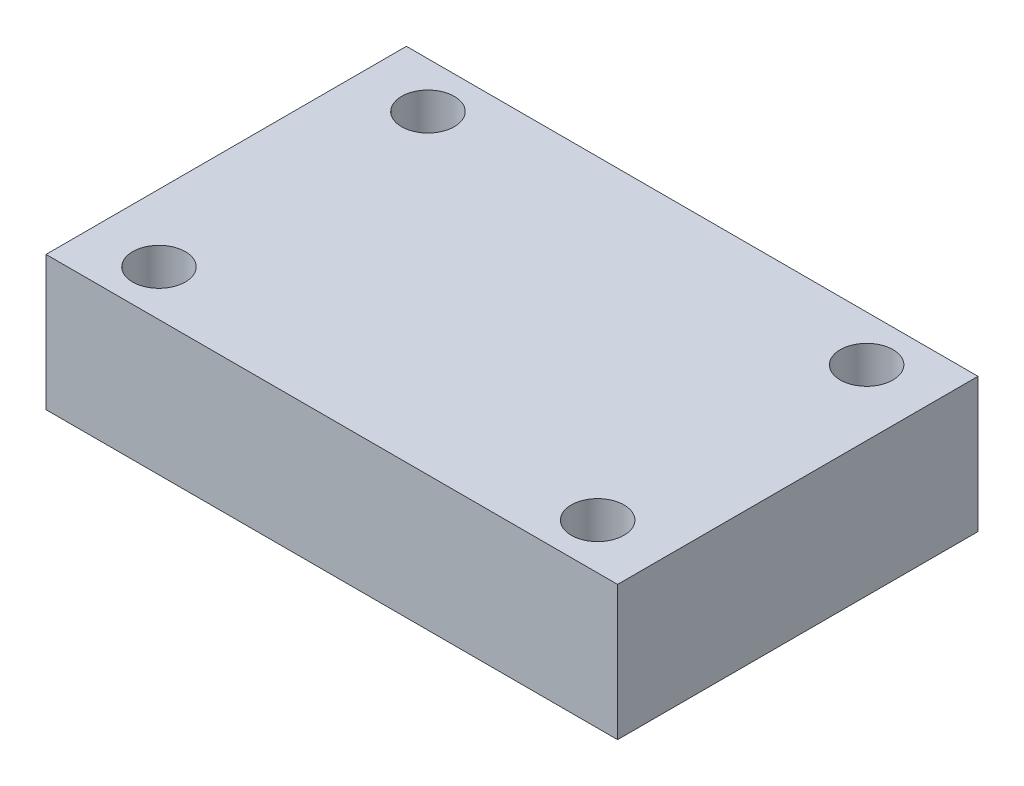
ISO-10303-21;
HEADER;
FILE_DESCRIPTION(('STEP AP214'),'2;1');
FILE_NAME('part.step','',(''),(''),'','','');
FILE_SCHEMA(('AUTOMOTIVE_DESIGN { 1 0 10303 214 1 1 1 1 }'));
ENDSEC;
DATA;
#1=APPLICATION_CONTEXT('core data for automotive mechanical design processes');
#2=APPLICATION_PROTOCOL_DEFINITION('international standard','automotive_design',2000,#1);
#3=PRODUCT_CONTEXT('',#1,'mechanical');
#4=PRODUCT('Part','Part','',(#3));
#5=PRODUCT_RELATED_PRODUCT_CATEGORY('part','',(#4));
#6=PRODUCT_DEFINITION_FORMATION('','',#4);
#7=PRODUCT_DEFINITION_CONTEXT('part definition',#1,'design');
#8=PRODUCT_DEFINITION('design','',#6,#7);
#9=PRODUCT_DEFINITION_SHAPE('','',#8);
#10=(LENGTH_UNIT() NAMED_UNIT(*) SI_UNIT(.MILLI.,.METRE.));
#11=(NAMED_UNIT(*) PLANE_ANGLE_UNIT() SI_UNIT($,.RADIAN.));
#12=(NAMED_UNIT(*) SI_UNIT($,.STERADIAN.) SOLID_ANGLE_UNIT());
#13=UNCERTAINTY_MEASURE_WITH_UNIT(LENGTH_MEASURE(1.E-05),#10,'distance_accuracy_value','');
#14=(GEOMETRIC_REPRESENTATION_CONTEXT(3) GLOBAL_UNCERTAINTY_ASSIGNED_CONTEXT((#13)) GLOBAL_UNIT_ASSIGNED_CONTEXT((#10,
#11,#12)) REPRESENTATION_CONTEXT('',''));
#15=CARTESIAN_POINT('',(0.,0.,0.));
#16=DIRECTION('',(0.,0.,1.));
#17=DIRECTION('',(1.,0.,0.));
#18=AXIS2_PLACEMENT_3D('',#15,#16,#17);
#19=CARTESIAN_POINT('',(26.9875,12.7,-17.018));
#20=DIRECTION('',(-1.,0.,0.));
#21=DIRECTION('',(0.,0.,1.));
#22=AXIS2_PLACEMENT_3D('',#19,#20,#21);
#23=PLANE('',#22);
#24=DIRECTION('',(0.,0.,-1.));
#25=VECTOR('',#24,1.);
#26=CARTESIAN_POINT('',(26.9875,0.,-17.018));
#27=LINE('',#26,#25);
#28=CARTESIAN_POINT('',(26.9875,0.,17.018));
#29=VERTEX_POINT('',#28);
#30=CARTESIAN_POINT('',(26.9875,0.,-17.018));
#31=VERTEX_POINT('',#30);
#32=EDGE_CURVE('E100',#29,#31,#27,.T.);
#33=ORIENTED_EDGE('',*,*,#32,.T.);
#34=DIRECTION('',(0.,-1.,0.));
#35=VECTOR('',#34,1.);
#36=CARTESIAN_POINT('',(26.9875,12.7,-17.018));
#37=LINE('',#36,#35);
#38=CARTESIAN_POINT('',(26.9875,12.7,-17.018));
#39=VERTEX_POINT('',#38);
#40=EDGE_CURVE('E11',#39,#31,#37,.T.);
#41=ORIENTED_EDGE('',*,*,#40,.F.);
#42=DIRECTION('',(0.,0.,-1.));
#43=VECTOR('',#42,1.);
#44=CARTESIAN_POINT('',(26.9875,12.7,-17.018));
#45=LINE('',#44,#43);
#46=CARTESIAN_POINT('',(26.9875,12.7,17.018));
#47=VERTEX_POINT('',#46);
#48=EDGE_CURVE('E88',#47,#39,#45,.T.);
#49=ORIENTED_EDGE('',*,*,#48,.F.);
#50=DIRECTION('',(0.,-1.,0.));
#51=VECTOR('',#50,1.);
#52=CARTESIAN_POINT('',(26.9875,12.7,17.018));
#53=LINE('',#52,#51);
#54=EDGE_CURVE('E96',#47,#29,#53,.T.);
#55=ORIENTED_EDGE('',*,*,#54,.T.);
#56=EDGE_LOOP('',(#33,#41,#49,#55));
#57=FACE_BOUND('',#56,.T.);
#58=ADVANCED_FACE('F37',(#57),#23,.F.);
#59=CARTESIAN_POINT('',(-26.9875,12.7,-17.018));
#60=DIRECTION('',(0.,0.,1.));
#61=DIRECTION('',(1.,0.,0.));
#62=AXIS2_PLACEMENT_3D('',#59,#60,#61);
#63=PLANE('',#62);
#64=DIRECTION('',(-1.,0.,0.));
#65=VECTOR('',#64,1.);
#66=CARTESIAN_POINT('',(-26.9875,0.,-17.018));
#67=LINE('',#66,#65);
#68=CARTESIAN_POINT('',(-26.9875,0.,-17.018));
#69=VERTEX_POINT('',#68);
#70=EDGE_CURVE('E92',#31,#69,#67,.T.);
#71=ORIENTED_EDGE('',*,*,#70,.T.);
#72=DIRECTION('',(0.,-1.,0.));
#73=VECTOR('',#72,1.);
#74=CARTESIAN_POINT('',(-26.9875,12.7,-17.018));
#75=LINE('',#74,#73);
#76=CARTESIAN_POINT('',(-26.9875,12.7,-17.018));
#77=VERTEX_POINT('',#76);
#78=EDGE_CURVE('E45',#77,#69,#75,.T.);
#79=ORIENTED_EDGE('',*,*,#78,.F.);
#80=DIRECTION('',(-1.,0.,0.));
#81=VECTOR('',#80,1.);
#82=CARTESIAN_POINT('',(-26.9875,12.7,-17.018));
#83=LINE('',#82,#81);
#84=EDGE_CURVE('E83',#39,#77,#83,.T.);
#85=ORIENTED_EDGE('',*,*,#84,.F.);
#86=ORIENTED_EDGE('',*,*,#40,.T.);
#87=EDGE_LOOP('',(#71,#79,#85,#86));
#88=FACE_BOUND('',#87,.T.);
#89=ADVANCED_FACE('F91',(#88),#63,.F.);
#90=CARTESIAN_POINT('',(-26.9875,12.7,-17.018));
#91=DIRECTION('',(1.,0.,0.));
#92=DIRECTION('',(0.,0.,-1.));
#93=AXIS2_PLACEMENT_3D('',#90,#91,#92);
#94=PLANE('',#93);
#95=DIRECTION('',(0.,0.,1.));
#96=VECTOR('',#95,1.);
#97=CARTESIAN_POINT('',(-26.9875,0.,-17.018));
#98=LINE('',#97,#96);
#99=CARTESIAN_POINT('',(-26.9875,0.,17.018));
#100=VERTEX_POINT('',#99);
#101=EDGE_CURVE('E70',#69,#100,#98,.T.);
#102=ORIENTED_EDGE('',*,*,#101,.T.);
#103=DIRECTION('',(0.,-1.,0.));
#104=VECTOR('',#103,1.);
#105=CARTESIAN_POINT('',(-26.9875,12.7,17.018));
#106=LINE('',#105,#104);
#107=CARTESIAN_POINT('',(-26.9875,12.7,17.018));
#108=VERTEX_POINT('',#107);
#109=EDGE_CURVE('E93',#108,#100,#106,.T.);
#110=ORIENTED_EDGE('',*,*,#109,.F.);
#111=DIRECTION('',(0.,0.,1.));
#112=VECTOR('',#111,1.);
#113=CARTESIAN_POINT('',(-26.9875,12.7,-17.018));
#114=LINE('',#113,#112);
#115=EDGE_CURVE('E86',#77,#108,#114,.T.);
#116=ORIENTED_EDGE('',*,*,#115,.F.);
#117=ORIENTED_EDGE('',*,*,#78,.T.);
#118=EDGE_LOOP('',(#102,#110,#116,#117));
#119=FACE_BOUND('',#118,.T.);
#120=ADVANCED_FACE('F94',(#119),#94,.F.);
#121=CARTESIAN_POINT('',(-26.9875,12.7,17.018));
#122=DIRECTION('',(0.,0.,-1.));
#123=DIRECTION('',(-1.,0.,0.));
#124=AXIS2_PLACEMENT_3D('',#121,#122,#123);
#125=PLANE('',#124);
#126=DIRECTION('',(1.,0.,0.));
#127=VECTOR('',#126,1.);
#128=CARTESIAN_POINT('',(-26.9875,0.,17.018));
#129=LINE('',#128,#127);
#130=EDGE_CURVE('E76',#100,#29,#129,.T.);
#131=ORIENTED_EDGE('',*,*,#130,.T.);
#132=ORIENTED_EDGE('',*,*,#54,.F.);
#133=DIRECTION('',(1.,0.,0.));
#134=VECTOR('',#133,1.);
#135=CARTESIAN_POINT('',(-26.9875,12.7,17.018));
#136=LINE('',#135,#134);
#137=EDGE_CURVE('E53',#108,#47,#136,.T.);
#138=ORIENTED_EDGE('',*,*,#137,.F.);
#139=ORIENTED_EDGE('',*,*,#109,.T.);
#140=EDGE_LOOP('',(#131,#132,#138,#139));
#141=FACE_BOUND('',#140,.T.);
#142=ADVANCED_FACE('F108',(#141),#125,.F.);
#143=CARTESIAN_POINT('',(0.,12.7,0.));
#144=DIRECTION('',(0.,1.,0.));
#145=DIRECTION('',(0.,0.,1.));
#146=AXIS2_PLACEMENT_3D('',#143,#144,#145);
#147=PLANE('',#146);
#148=CARTESIAN_POINT('',(-20.6375,12.7,-12.7));
#149=DIRECTION('',(0.,1.,0.));
#150=DIRECTION('',(0.,0.,1.));
#151=AXIS2_PLACEMENT_3D('',#148,#149,#150);
#152=CIRCLE('',#151,2.48919999999999);
#153=CARTESIAN_POINT('',(-20.6375,12.7,-10.2108));
#154=VERTEX_POINT('',#153);
#155=EDGE_CURVE('E134',#154,#154,#152,.T.);
#156=ORIENTED_EDGE('',*,*,#155,.F.);
#157=EDGE_LOOP('',(#156));
#158=FACE_BOUND('',#157,.T.);
#159=CARTESIAN_POINT('',(-20.6375,12.7,12.7));
#160=DIRECTION('',(0.,1.,0.));
#161=DIRECTION('',(0.,0.,1.));
#162=AXIS2_PLACEMENT_3D('',#159,#160,#161);
#163=CIRCLE('',#162,2.48919999999999);
#164=CARTESIAN_POINT('',(-20.6375,12.7,15.1892));
#165=VERTEX_POINT('',#164);
#166=EDGE_CURVE('E128',#165,#165,#163,.T.);
#167=ORIENTED_EDGE('',*,*,#166,.F.);
#168=EDGE_LOOP('',(#167));
#169=FACE_BOUND('',#168,.T.);
#170=CARTESIAN_POINT('',(20.7899,12.7,12.7));
#171=DIRECTION('',(0.,1.,0.));
#172=DIRECTION('',(0.,0.,1.));
#173=AXIS2_PLACEMENT_3D('',#170,#171,#172);
#174=CIRCLE('',#173,2.48919999999999);
#175=CARTESIAN_POINT('',(20.7899,12.7,15.1892));
#176=VERTEX_POINT('',#175);
#177=EDGE_CURVE('E122',#176,#176,#174,.T.);
#178=ORIENTED_EDGE('',*,*,#177,.F.);
#179=EDGE_LOOP('',(#178));
#180=FACE_BOUND('',#179,.T.);
#181=CARTESIAN_POINT('',(20.7899,12.7,-12.7));
#182=DIRECTION('',(0.,1.,0.));
#183=DIRECTION('',(0.,0.,1.));
#184=AXIS2_PLACEMENT_3D('',#181,#182,#183);
#185=CIRCLE('',#184,2.48919999999999);
#186=CARTESIAN_POINT('',(20.7899,12.7,-10.2108));
#187=VERTEX_POINT('',#186);
#188=EDGE_CURVE('E116',#187,#187,#185,.T.);
#189=ORIENTED_EDGE('',*,*,#188,.F.);
#190=EDGE_LOOP('',(#189));
#191=FACE_BOUND('',#190,.T.);
#192=ORIENTED_EDGE('',*,*,#48,.T.);
#193=ORIENTED_EDGE('',*,*,#84,.T.);
#194=ORIENTED_EDGE('',*,*,#115,.T.);
#195=ORIENTED_EDGE('',*,*,#137,.T.);
#196=EDGE_LOOP('',(#192,#193,#194,#195));
#197=FACE_BOUND('',#196,.T.);
#198=ADVANCED_FACE('F84',(#158,#169,#180,#191,#197),#147,.T.);
#199=CARTESIAN_POINT('',(0.,0.,0.));
#200=DIRECTION('',(0.,1.,0.));
#201=DIRECTION('',(0.,0.,1.));
#202=AXIS2_PLACEMENT_3D('',#199,#200,#201);
#203=PLANE('',#202);
#204=CARTESIAN_POINT('',(-20.6375,0.,-12.7));
#205=DIRECTION('',(0.,1.,0.));
#206=DIRECTION('',(0.,0.,1.));
#207=AXIS2_PLACEMENT_3D('',#204,#205,#206);
#208=CIRCLE('',#207,2.4892);
#209=CARTESIAN_POINT('',(-20.6375,0.,-10.2108));
#210=VERTEX_POINT('',#209);
#211=EDGE_CURVE('E131',#210,#210,#208,.T.);
#212=ORIENTED_EDGE('',*,*,#211,.T.);
#213=EDGE_LOOP('',(#212));
#214=FACE_BOUND('',#213,.T.);
#215=CARTESIAN_POINT('',(-20.6375,0.,12.7));
#216=DIRECTION('',(0.,1.,0.));
#217=DIRECTION('',(0.,0.,1.));
#218=AXIS2_PLACEMENT_3D('',#215,#216,#217);
#219=CIRCLE('',#218,2.4892);
#220=CARTESIAN_POINT('',(-20.6375,0.,15.1892));
#221=VERTEX_POINT('',#220);
#222=EDGE_CURVE('E125',#221,#221,#219,.T.);
#223=ORIENTED_EDGE('',*,*,#222,.T.);
#224=EDGE_LOOP('',(#223));
#225=FACE_BOUND('',#224,.T.);
#226=CARTESIAN_POINT('',(20.7899,0.,12.7));
#227=DIRECTION('',(0.,1.,0.));
#228=DIRECTION('',(0.,0.,1.));
#229=AXIS2_PLACEMENT_3D('',#226,#227,#228);
#230=CIRCLE('',#229,2.4892);
#231=CARTESIAN_POINT('',(20.7899,0.,15.1892));
#232=VERTEX_POINT('',#231);
#233=EDGE_CURVE('E119',#232,#232,#230,.T.);
#234=ORIENTED_EDGE('',*,*,#233,.T.);
#235=EDGE_LOOP('',(#234));
#236=FACE_BOUND('',#235,.T.);
#237=CARTESIAN_POINT('',(20.7899,0.,-12.7));
#238=DIRECTION('',(0.,1.,0.));
#239=DIRECTION('',(0.,0.,1.));
#240=AXIS2_PLACEMENT_3D('',#237,#238,#239);
#241=CIRCLE('',#240,2.4892);
#242=CARTESIAN_POINT('',(20.7899,0.,-10.2108));
#243=VERTEX_POINT('',#242);
#244=EDGE_CURVE('E103',#243,#243,#241,.T.);
#245=ORIENTED_EDGE('',*,*,#244,.T.);
#246=EDGE_LOOP('',(#245));
#247=FACE_BOUND('',#246,.T.);
#248=ORIENTED_EDGE('',*,*,#32,.F.);
#249=ORIENTED_EDGE('',*,*,#130,.F.);
#250=ORIENTED_EDGE('',*,*,#101,.F.);
#251=ORIENTED_EDGE('',*,*,#70,.F.);
#252=EDGE_LOOP('',(#248,#249,#250,#251));
#253=FACE_BOUND('',#252,.T.);
#254=ADVANCED_FACE('F111',(#214,#225,#236,#247,#253),#203,.F.);
#255=CARTESIAN_POINT('',(20.7899,12.7,-12.7));
#256=DIRECTION('',(0.,1.,0.));
#257=DIRECTION('',(0.,0.,1.));
#258=AXIS2_PLACEMENT_3D('',#255,#256,#257);
#259=CYLINDRICAL_SURFACE('',#258,2.48919999999999);
#260=ORIENTED_EDGE('',*,*,#244,.F.);
#261=EDGE_LOOP('',(#260));
#262=FACE_BOUND('',#261,.T.);
#263=ORIENTED_EDGE('',*,*,#188,.T.);
#264=EDGE_LOOP('',(#263));
#265=FACE_BOUND('',#264,.T.);
#266=ADVANCED_FACE('F149',(#262,#265),#259,.F.);
#267=CARTESIAN_POINT('',(20.7899,12.7,12.7));
#268=DIRECTION('',(0.,1.,0.));
#269=DIRECTION('',(0.,0.,1.));
#270=AXIS2_PLACEMENT_3D('',#267,#268,#269);
#271=CYLINDRICAL_SURFACE('',#270,2.48919999999999);
#272=ORIENTED_EDGE('',*,*,#233,.F.);
#273=EDGE_LOOP('',(#272));
#274=FACE_BOUND('',#273,.T.);
#275=ORIENTED_EDGE('',*,*,#177,.T.);
#276=EDGE_LOOP('',(#275));
#277=FACE_BOUND('',#276,.T.);
#278=ADVANCED_FACE('F151',(#274,#277),#271,.F.);
#279=CARTESIAN_POINT('',(-20.6375,12.7,12.7));
#280=DIRECTION('',(0.,1.,0.));
#281=DIRECTION('',(0.,0.,1.));
#282=AXIS2_PLACEMENT_3D('',#279,#280,#281);
#283=CYLINDRICAL_SURFACE('',#282,2.48919999999999);
#284=ORIENTED_EDGE('',*,*,#222,.F.);
#285=EDGE_LOOP('',(#284));
#286=FACE_BOUND('',#285,.T.);
#287=ORIENTED_EDGE('',*,*,#166,.T.);
#288=EDGE_LOOP('',(#287));
#289=FACE_BOUND('',#288,.T.);
#290=ADVANCED_FACE('F158',(#286,#289),#283,.F.);
#291=CARTESIAN_POINT('',(-20.6375,12.7,-12.7));
#292=DIRECTION('',(0.,1.,0.));
#293=DIRECTION('',(0.,0.,1.));
#294=AXIS2_PLACEMENT_3D('',#291,#292,#293);
#295=CYLINDRICAL_SURFACE('',#294,2.48919999999999);
#296=ORIENTED_EDGE('',*,*,#211,.F.);
#297=EDGE_LOOP('',(#296));
#298=FACE_BOUND('',#297,.T.);
#299=ORIENTED_EDGE('',*,*,#155,.T.);
#300=EDGE_LOOP('',(#299));
#301=FACE_BOUND('',#300,.T.);
#302=ADVANCED_FACE('F138',(#298,#301),#295,.F.);
#303=CLOSED_SHELL('',(#58,#89,#120,#142,#198,#254,#266,#278,#290,#302));
#304=MANIFOLD_SOLID_BREP('B2',#303);
#305=ADVANCED_BREP_SHAPE_REPRESENTATION('',(#18,#304),#14);
#306=SHAPE_DEFINITION_REPRESENTATION(#9,#305);
ENDSEC;
END-ISO-10303-21;
